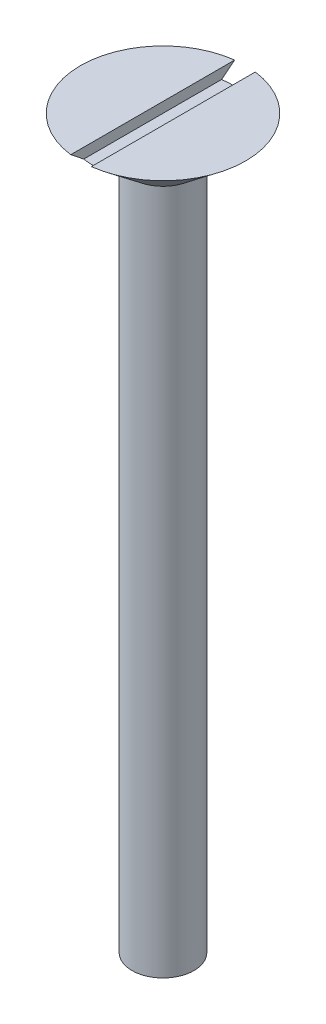
ISO-10303-21;
HEADER;
FILE_DESCRIPTION(('STEP AP214'),'2;1');
FILE_NAME('part.step','',(''),(''),'','','');
FILE_SCHEMA(('AUTOMOTIVE_DESIGN { 1 0 10303 214 1 1 1 1 }'));
ENDSEC;
DATA;
#1=APPLICATION_CONTEXT('core data for automotive mechanical design processes');
#2=APPLICATION_PROTOCOL_DEFINITION('international standard','automotive_design',2000,#1);
#3=PRODUCT_CONTEXT('',#1,'mechanical');
#4=PRODUCT('Part','Part','',(#3));
#5=PRODUCT_RELATED_PRODUCT_CATEGORY('part','',(#4));
#6=PRODUCT_DEFINITION_FORMATION('','',#4);
#7=PRODUCT_DEFINITION_CONTEXT('part definition',#1,'design');
#8=PRODUCT_DEFINITION('design','',#6,#7);
#9=PRODUCT_DEFINITION_SHAPE('','',#8);
#10=(LENGTH_UNIT() NAMED_UNIT(*) SI_UNIT(.MILLI.,.METRE.));
#11=(NAMED_UNIT(*) PLANE_ANGLE_UNIT() SI_UNIT($,.RADIAN.));
#12=(NAMED_UNIT(*) SI_UNIT($,.STERADIAN.) SOLID_ANGLE_UNIT());
#13=UNCERTAINTY_MEASURE_WITH_UNIT(LENGTH_MEASURE(1.E-05),#10,'distance_accuracy_value','');
#14=(GEOMETRIC_REPRESENTATION_CONTEXT(3) GLOBAL_UNCERTAINTY_ASSIGNED_CONTEXT((#13)) GLOBAL_UNIT_ASSIGNED_CONTEXT((#10,
#11,#12)) REPRESENTATION_CONTEXT('',''));
#15=CARTESIAN_POINT('',(0.,0.,0.));
#16=DIRECTION('',(0.,0.,1.));
#17=DIRECTION('',(1.,0.,0.));
#18=AXIS2_PLACEMENT_3D('',#15,#16,#17);
#19=CARTESIAN_POINT('',(0.,0.,0.));
#20=DIRECTION('',(0.,1.,0.));
#21=DIRECTION('',(0.,0.,1.));
#22=AXIS2_PLACEMENT_3D('',#19,#20,#21);
#23=PLANE('',#22);
#24=DIRECTION('',(0.,0.,-1.));
#25=VECTOR('',#24,1.);
#26=CARTESIAN_POINT('',(0.5,0.,4.154122802003));
#27=LINE('',#26,#25);
#28=CARTESIAN_POINT('',(0.5,0.,3.96862696659689));
#29=VERTEX_POINT('',#28);
#30=CARTESIAN_POINT('',(0.5,0.,-3.96862696659689));
#31=VERTEX_POINT('',#30);
#32=EDGE_CURVE('E90',#29,#31,#27,.T.);
#33=ORIENTED_EDGE('',*,*,#32,.F.);
#34=CARTESIAN_POINT('',(0.,0.,0.));
#35=DIRECTION('',(0.,-1.,0.));
#36=DIRECTION('',(0.,0.,-1.));
#37=AXIS2_PLACEMENT_3D('',#34,#35,#36);
#38=CIRCLE('',#37,4.);
#39=EDGE_CURVE('E97',#31,#29,#38,.T.);
#40=ORIENTED_EDGE('',*,*,#39,.F.);
#41=EDGE_LOOP('',(#33,#40));
#42=FACE_BOUND('',#41,.T.);
#43=ADVANCED_FACE('F43',(#42),#23,.T.);
#44=DIRECTION('',(0.,0.,1.));
#45=VECTOR('',#44,1.);
#46=CARTESIAN_POINT('',(-0.5,0.,4.154122802003));
#47=LINE('',#46,#45);
#48=CARTESIAN_POINT('',(-0.5,0.,-3.96862696659689));
#49=VERTEX_POINT('',#48);
#50=CARTESIAN_POINT('',(-0.5,0.,3.96862696659689));
#51=VERTEX_POINT('',#50);
#52=EDGE_CURVE('E98',#49,#51,#47,.T.);
#53=ORIENTED_EDGE('',*,*,#52,.F.);
#54=EDGE_CURVE('E105',#51,#49,#38,.T.);
#55=ORIENTED_EDGE('',*,*,#54,.F.);
#56=EDGE_LOOP('',(#53,#55));
#57=FACE_BOUND('',#56,.T.);
#58=ADVANCED_FACE('F45',(#57),#23,.T.);
#59=CARTESIAN_POINT('',(0.,-2.,0.));
#60=DIRECTION('',(0.,1.,0.));
#61=DIRECTION('',(0.,0.,1.));
#62=AXIS2_PLACEMENT_3D('',#59,#60,#61);
#63=CONICAL_SURFACE('',#62,1.5,0.896055384571344);
#64=CARTESIAN_POINT('',(0.5,0.0007,-3.96950888216981));
#65=CARTESIAN_POINT('',(0.5,-0.0849165023699563,-3.86163967543168));
#66=CARTESIAN_POINT('',(0.5,-0.170502285170619,-3.75374605179473));
#67=CARTESIAN_POINT('',(0.5,-0.341656342764282,-3.53780257000272));
#68=CARTESIAN_POINT('',(0.5,-0.427224547201753,-3.42975265608924));
#69=CARTESIAN_POINT('',(0.5,-0.599310209490072,-3.21222191026573));
#70=CARTESIAN_POINT('',(0.5,-0.685826263463784,-3.10273996752559));
#71=CARTESIAN_POINT('',(0.5,-0.858631507298039,-2.88374094085675));
#72=CARTESIAN_POINT('',(0.5,-0.944920824127245,-2.77422395715472));
#73=CARTESIAN_POINT('',(0.5,-1.10449390377997,-2.57127620190392));
#74=CARTESIAN_POINT('',(0.5,-1.17780799299997,-2.47786928127077));
#75=CARTESIAN_POINT('',(0.5,-1.32422251325456,-2.290871081503));
#76=CARTESIAN_POINT('',(0.5,-1.39732291936885,-2.19727978284154));
#77=CARTESIAN_POINT('',(0.5,-1.54343242848754,-2.00955497780229));
#78=CARTESIAN_POINT('',(0.5,-1.61644052942068,-1.9154206912297));
#79=CARTESIAN_POINT('',(0.5,-1.76194048771337,-1.7268187631654));
#80=CARTESIAN_POINT('',(0.5,-1.83443255740708,-1.63235128594972));
#81=CARTESIAN_POINT('',(0.5,-1.97776998979503,-1.44394309616818));
#82=CARTESIAN_POINT('',(0.5,-2.0486246832269,-1.35000948104741));
#83=CARTESIAN_POINT('',(0.5,-2.18913129599316,-1.16099731994404));
#84=CARTESIAN_POINT('',(0.5,-2.25878106402711,-1.06591715581982));
#85=CARTESIAN_POINT('',(0.5,-2.36099982523872,-0.922138886261497));
#86=CARTESIAN_POINT('',(0.5,-2.39459472985591,-0.874172268915431));
#87=CARTESIAN_POINT('',(0.5,-2.46074016373396,-0.777526804450004));
#88=CARTESIAN_POINT('',(0.5,-2.49329083769703,-0.728848057385722));
#89=CARTESIAN_POINT('',(0.5,-2.55664185197658,-0.630541590346451));
#90=CARTESIAN_POINT('',(0.5,-2.58744653072054,-0.580916672551348));
#91=CARTESIAN_POINT('',(0.5,-2.64620420928734,-0.480016414066409));
#92=CARTESIAN_POINT('',(0.5,-2.67416068922349,-0.428743190707143));
#93=CARTESIAN_POINT('',(0.5,-2.70449858296453,-0.365644309264434));
#94=CARTESIAN_POINT('',(0.5,-2.70945461893437,-0.355060527391768));
#95=CARTESIAN_POINT('',(0.5,-2.7191145434353,-0.333776664640728));
#96=CARTESIAN_POINT('',(0.5,-2.72381839025734,-0.323076564874589));
#97=CARTESIAN_POINT('',(0.5,-2.73749944880417,-0.290796283206236));
#98=CARTESIAN_POINT('',(0.5,-2.7460487095841,-0.26903093328599));
#99=CARTESIAN_POINT('',(0.5,-2.76155676868638,-0.22526154121403));
#100=CARTESIAN_POINT('',(0.5,-2.76853530900078,-0.203264584548543));
#101=CARTESIAN_POINT('',(0.5,-2.78065410784344,-0.158758052606351));
#102=CARTESIAN_POINT('',(0.5,-2.78579443356758,-0.13624849609972));
#103=CARTESIAN_POINT('',(0.5,-2.79309908524597,-0.0950072414424992));
#104=CARTESIAN_POINT('',(0.5,-2.79563695186348,-0.0763424492707343));
#105=CARTESIAN_POINT('',(0.5,-2.79907103222669,-0.0388695155849392));
#106=CARTESIAN_POINT('',(0.5,-2.79996787253948,-0.0200614315372762));
#107=CARTESIAN_POINT('',(0.5,-2.80006039024912,0.0362991883155137));
#108=CARTESIAN_POINT('',(0.5,-2.79667500883115,0.0738792604370195));
#109=CARTESIAN_POINT('',(0.5,-2.78137004038277,0.162466941108722));
#110=CARTESIAN_POINT('',(0.5,-2.76662066728367,0.212950897532982));
#111=CARTESIAN_POINT('',(0.5,-2.73921524830917,0.286771538817558));
#112=CARTESIAN_POINT('',(0.5,-2.72913282569691,0.311183854779621));
#113=CARTESIAN_POINT('',(0.5,-2.70763740364262,0.35941708149117));
#114=CARTESIAN_POINT('',(0.5,-2.69622480381569,0.3832381672643));
#115=CARTESIAN_POINT('',(0.5,-2.65774182427754,0.459494267363883));
#116=CARTESIAN_POINT('',(0.5,-2.62873915199804,0.510939109138477));
#117=CARTESIAN_POINT('',(0.5,-2.56815383743606,0.612300106377371));
#118=CARTESIAN_POINT('',(0.5,-2.53656877244107,0.662214764503145));
#119=CARTESIAN_POINT('',(0.5,-2.47180178509868,0.761157389350541));
#120=CARTESIAN_POINT('',(0.5,-2.43861634586317,0.810183044014906));
#121=CARTESIAN_POINT('',(0.5,-2.37127990274308,0.907568911622613));
#122=CARTESIAN_POINT('',(0.5,-2.33712879565317,0.955929052612087));
#123=CARTESIAN_POINT('',(0.5,-2.23364926190614,1.10045142784891));
#124=CARTESIAN_POINT('',(0.5,-2.1633761057542,1.19593529439254));
#125=CARTESIAN_POINT('',(0.5,-2.02169747569066,1.38582135122896));
#126=CARTESIAN_POINT('',(0.5,-1.95029390545647,1.48022497690765));
#127=CARTESIAN_POINT('',(0.5,-1.80109959502258,1.67590003480187));
#128=CARTESIAN_POINT('',(0.5,-1.72324920791508,1.77712598596886));
#129=CARTESIAN_POINT('',(0.5,-1.56703755198854,1.9791846282383));
#130=CARTESIAN_POINT('',(0.5,-1.48867627425172,2.08001731242677));
#131=CARTESIAN_POINT('',(0.5,-1.25300183322107,2.38226692347977));
#132=CARTESIAN_POINT('',(0.5,-1.0952001533504,2.58330271919452));
#133=CARTESIAN_POINT('',(0.5,-0.781185129206328,2.98208851051039));
#134=CARTESIAN_POINT('',(0.5,-0.624980312880044,3.17984524024286));
#135=CARTESIAN_POINT('',(0.5,-0.312308061533087,3.5749237197886));
#136=CARTESIAN_POINT('',(0.5,-0.155840890320149,3.77224567830265));
#137=CARTESIAN_POINT('',(0.5,0.000699999999999761,3.96950888216981));
#138=B_SPLINE_CURVE_WITH_KNOTS('',3,(#64,#65,#66,#67,#68,#69,#70,#71,#72,#73,#74,#75,#76,#77,
#78,#79,#80,#81,#82,#83,#84,#85,#86,#87,#88,#89,#90,#91,#92,#93,#94,#95,#96,#97,#98,#99,#100,
#101,#102,#103,#104,#105,#106,#107,#108,#109,#110,#111,#112,#113,#114,#115,#116,#117,#118,#119,
#120,#121,#122,#123,#124,#125,#126,#127,#128,#129,#130,#131,#132,#133,#134,#135,#136,#137),
.UNSPECIFIED.,.F.,.F.,(4,2,2,2,2,2,2,2,2,2,2,2,2,2,2,2,2,2,2,2,2,2,2,2,2,2,2,2,2,2,2,2,2,2,2,2,
4),(0.,0.413150808554029,0.82663632537773,1.24525527914814,1.66353528711512,2.01976291794065,
2.37603055608401,2.73341339965948,3.09063953124349,3.44361707873357,3.79717060116175,
3.97284705295861,4.14849905464527,4.32369351642409,4.49867128014781,4.53372821673397,
4.56879093354214,4.63889907513082,4.70806957493471,4.77723754595436,4.83367940292317,
4.89009970509133,5.00266641980551,5.15944717162594,5.23867342336855,5.31787593481953,
5.49488269462284,5.67205746474493,5.84964110426015,6.02724379522197,6.38288495455736,
6.73798020727408,7.12107781132008,7.50418212047784,8.27089298468056,9.02691460274215,
9.78240162361555),.UNSPECIFIED.);
#139=CARTESIAN_POINT('',(0.5,-0.5,3.33775748070467));
#140=VERTEX_POINT('',#139);
#141=EDGE_CURVE('E11',#140,#29,#138,.T.);
#142=ORIENTED_EDGE('',*,*,#141,.F.);
#143=CARTESIAN_POINT('',(0.,-0.5,0.));
#144=DIRECTION('',(0.,-1.,0.));
#145=DIRECTION('',(0.,0.,-1.));
#146=AXIS2_PLACEMENT_3D('',#143,#144,#145);
#147=CIRCLE('',#146,3.375);
#148=CARTESIAN_POINT('',(-0.5,-0.5,3.33775748070467));
#149=VERTEX_POINT('',#148);
#150=EDGE_CURVE('E109',#149,#140,#147,.F.);
#151=ORIENTED_EDGE('',*,*,#150,.F.);
#152=CARTESIAN_POINT('',(-0.5,0.0007,3.96950888216981));
#153=CARTESIAN_POINT('',(-0.5,-0.0849165023699563,3.86163967543168));
#154=CARTESIAN_POINT('',(-0.5,-0.170502285170619,3.75374605179473));
#155=CARTESIAN_POINT('',(-0.5,-0.341656342764282,3.53780257000272));
#156=CARTESIAN_POINT('',(-0.5,-0.427224547201753,3.42975265608924));
#157=CARTESIAN_POINT('',(-0.5,-0.599310209490072,3.21222191026573));
#158=CARTESIAN_POINT('',(-0.5,-0.685826263463784,3.10273996752559));
#159=CARTESIAN_POINT('',(-0.5,-0.858631507298039,2.88374094085675));
#160=CARTESIAN_POINT('',(-0.5,-0.944920824127245,2.77422395715472));
#161=CARTESIAN_POINT('',(-0.5,-1.10449390377997,2.57127620190392));
#162=CARTESIAN_POINT('',(-0.5,-1.17780799299997,2.47786928127077));
#163=CARTESIAN_POINT('',(-0.5,-1.32422251325456,2.290871081503));
#164=CARTESIAN_POINT('',(-0.5,-1.39732291936885,2.19727978284154));
#165=CARTESIAN_POINT('',(-0.5,-1.54343242848754,2.00955497780229));
#166=CARTESIAN_POINT('',(-0.5,-1.61644052942068,1.9154206912297));
#167=CARTESIAN_POINT('',(-0.5,-1.76194048771337,1.7268187631654));
#168=CARTESIAN_POINT('',(-0.5,-1.83443255740708,1.63235128594972));
#169=CARTESIAN_POINT('',(-0.5,-1.97776998979503,1.44394309616818));
#170=CARTESIAN_POINT('',(-0.5,-2.0486246832269,1.35000948104741));
#171=CARTESIAN_POINT('',(-0.5,-2.18913129599316,1.16099731994404));
#172=CARTESIAN_POINT('',(-0.5,-2.25878106402711,1.06591715581982));
#173=CARTESIAN_POINT('',(-0.5,-2.36099982523872,0.922138886261497));
#174=CARTESIAN_POINT('',(-0.5,-2.39459472985591,0.874172268915431));
#175=CARTESIAN_POINT('',(-0.5,-2.46074016373396,0.777526804450004));
#176=CARTESIAN_POINT('',(-0.5,-2.49329083769703,0.728848057385722));
#177=CARTESIAN_POINT('',(-0.5,-2.55664185197658,0.630541590346451));
#178=CARTESIAN_POINT('',(-0.5,-2.58744653072054,0.580916672551348));
#179=CARTESIAN_POINT('',(-0.5,-2.64620420928734,0.480016414066409));
#180=CARTESIAN_POINT('',(-0.5,-2.67416068922349,0.428743190707143));
#181=CARTESIAN_POINT('',(-0.5,-2.70449858296453,0.365644309264434));
#182=CARTESIAN_POINT('',(-0.5,-2.70945461893437,0.355060527391768));
#183=CARTESIAN_POINT('',(-0.5,-2.7191145434353,0.333776664640728));
#184=CARTESIAN_POINT('',(-0.5,-2.72381839025734,0.323076564874589));
#185=CARTESIAN_POINT('',(-0.5,-2.73749944880417,0.290796283206236));
#186=CARTESIAN_POINT('',(-0.5,-2.7460487095841,0.26903093328599));
#187=CARTESIAN_POINT('',(-0.5,-2.76155676868638,0.22526154121403));
#188=CARTESIAN_POINT('',(-0.5,-2.76853530900078,0.203264584548543));
#189=CARTESIAN_POINT('',(-0.5,-2.78065410784344,0.158758052606351));
#190=CARTESIAN_POINT('',(-0.5,-2.78579443356758,0.13624849609972));
#191=CARTESIAN_POINT('',(-0.5,-2.79309908524597,0.0950072414424992));
#192=CARTESIAN_POINT('',(-0.5,-2.79563695186348,0.0763424492707343));
#193=CARTESIAN_POINT('',(-0.5,-2.79907103222669,0.0388695155849392));
#194=CARTESIAN_POINT('',(-0.5,-2.79996787253948,0.0200614315372762));
#195=CARTESIAN_POINT('',(-0.5,-2.80006039024912,-0.0362991883155137));
#196=CARTESIAN_POINT('',(-0.5,-2.79667500883115,-0.0738792604370195));
#197=CARTESIAN_POINT('',(-0.5,-2.78137004038277,-0.162466941108722));
#198=CARTESIAN_POINT('',(-0.5,-2.76662066728367,-0.212950897532982));
#199=CARTESIAN_POINT('',(-0.5,-2.73921524830917,-0.286771538817558));
#200=CARTESIAN_POINT('',(-0.5,-2.72913282569691,-0.311183854779621));
#201=CARTESIAN_POINT('',(-0.5,-2.70763740364262,-0.35941708149117));
#202=CARTESIAN_POINT('',(-0.5,-2.69622480381569,-0.3832381672643));
#203=CARTESIAN_POINT('',(-0.5,-2.65774182427754,-0.459494267363883));
#204=CARTESIAN_POINT('',(-0.5,-2.62873915199804,-0.510939109138477));
#205=CARTESIAN_POINT('',(-0.5,-2.56815383743606,-0.612300106377371));
#206=CARTESIAN_POINT('',(-0.5,-2.53656877244107,-0.662214764503145));
#207=CARTESIAN_POINT('',(-0.5,-2.47180178509868,-0.761157389350541));
#208=CARTESIAN_POINT('',(-0.5,-2.43861634586317,-0.810183044014906));
#209=CARTESIAN_POINT('',(-0.5,-2.37127990274308,-0.907568911622613));
#210=CARTESIAN_POINT('',(-0.5,-2.33712879565317,-0.955929052612087));
#211=CARTESIAN_POINT('',(-0.5,-2.23364926190614,-1.10045142784891));
#212=CARTESIAN_POINT('',(-0.5,-2.1633761057542,-1.19593529439254));
#213=CARTESIAN_POINT('',(-0.5,-2.02169747569066,-1.38582135122896));
#214=CARTESIAN_POINT('',(-0.5,-1.95029390545647,-1.48022497690765));
#215=CARTESIAN_POINT('',(-0.5,-1.80109959502258,-1.67590003480187));
#216=CARTESIAN_POINT('',(-0.5,-1.72324920791508,-1.77712598596886));
#217=CARTESIAN_POINT('',(-0.5,-1.56703755198854,-1.9791846282383));
#218=CARTESIAN_POINT('',(-0.5,-1.48867627425172,-2.08001731242677));
#219=CARTESIAN_POINT('',(-0.5,-1.25300183322107,-2.38226692347977));
#220=CARTESIAN_POINT('',(-0.5,-1.0952001533504,-2.58330271919452));
#221=CARTESIAN_POINT('',(-0.5,-0.781185129206328,-2.98208851051039));
#222=CARTESIAN_POINT('',(-0.5,-0.624980312880044,-3.17984524024286));
#223=CARTESIAN_POINT('',(-0.5,-0.312308061533087,-3.5749237197886));
#224=CARTESIAN_POINT('',(-0.5,-0.155840890320149,-3.77224567830265));
#225=CARTESIAN_POINT('',(-0.5,0.000699999999999761,-3.96950888216981));
#226=B_SPLINE_CURVE_WITH_KNOTS('',3,(#152,#153,#154,#155,#156,#157,#158,#159,#160,#161,#162,
#163,#164,#165,#166,#167,#168,#169,#170,#171,#172,#173,#174,#175,#176,#177,#178,#179,#180,#181,
#182,#183,#184,#185,#186,#187,#188,#189,#190,#191,#192,#193,#194,#195,#196,#197,#198,#199,#200,
#201,#202,#203,#204,#205,#206,#207,#208,#209,#210,#211,#212,#213,#214,#215,#216,#217,#218,#219,
#220,#221,#222,#223,#224,#225),.UNSPECIFIED.,.F.,.F.,(4,2,2,2,2,2,2,2,2,2,2,2,2,2,2,2,2,2,2,2,2,
2,2,2,2,2,2,2,2,2,2,2,2,2,2,2,4),(0.,0.413150808554029,0.82663632537773,1.24525527914814,
1.66353528711512,2.01976291794065,2.37603055608401,2.73341339965948,3.09063953124349,
3.44361707873357,3.79717060116175,3.97284705295861,4.14849905464527,4.32369351642409,
4.49867128014781,4.53372821673397,4.56879093354214,4.63889907513082,4.70806957493471,
4.77723754595436,4.83367940292317,4.89009970509133,5.00266641980551,5.15944717162594,
5.23867342336855,5.31787593481953,5.49488269462284,5.67205746474493,5.84964110426015,
6.02724379522197,6.38288495455736,6.73798020727408,7.12107781132008,7.50418212047784,
8.27089298468056,9.02691460274215,9.78240162361555),.UNSPECIFIED.);
#227=EDGE_CURVE('E57',#51,#149,#226,.T.);
#228=ORIENTED_EDGE('',*,*,#227,.F.);
#229=ORIENTED_EDGE('',*,*,#54,.T.);
#230=CARTESIAN_POINT('',(-0.5,-0.5,-3.33775748070467));
#231=VERTEX_POINT('',#230);
#232=EDGE_CURVE('E107',#231,#49,#226,.T.);
#233=ORIENTED_EDGE('',*,*,#232,.F.);
#234=CARTESIAN_POINT('',(0.5,-0.5,-3.33775748070467));
#235=VERTEX_POINT('',#234);
#236=EDGE_CURVE('E104',#235,#231,#147,.F.);
#237=ORIENTED_EDGE('',*,*,#236,.F.);
#238=EDGE_CURVE('E47',#31,#235,#138,.T.);
#239=ORIENTED_EDGE('',*,*,#238,.F.);
#240=ORIENTED_EDGE('',*,*,#39,.T.);
#241=EDGE_LOOP('',(#142,#151,#228,#229,#233,#237,#239,#240));
#242=FACE_BOUND('',#241,.T.);
#243=CARTESIAN_POINT('',(0.,-2.,0.));
#244=DIRECTION('',(0.,-1.,0.));
#245=DIRECTION('',(0.,0.,-1.));
#246=AXIS2_PLACEMENT_3D('',#243,#244,#245);
#247=CIRCLE('',#246,1.5);
#248=CARTESIAN_POINT('',(0.,-2.,1.5));
#249=VERTEX_POINT('',#248);
#250=EDGE_CURVE('E111',#249,#249,#247,.T.);
#251=ORIENTED_EDGE('',*,*,#250,.F.);
#252=EDGE_LOOP('',(#251));
#253=FACE_BOUND('',#252,.T.);
#254=ADVANCED_FACE('F101',(#242,#253),#63,.T.);
#255=CARTESIAN_POINT('',(0.5,-0.5,4.154122802003));
#256=DIRECTION('',(1.,0.,0.));
#257=DIRECTION('',(0.,0.,-1.));
#258=AXIS2_PLACEMENT_3D('',#255,#256,#257);
#259=PLANE('',#258);
#260=ORIENTED_EDGE('',*,*,#238,.T.);
#261=DIRECTION('',(0.,0.,-1.));
#262=VECTOR('',#261,1.);
#263=CARTESIAN_POINT('',(0.5,-0.5,4.154122802003));
#264=LINE('',#263,#262);
#265=EDGE_CURVE('E64',#140,#235,#264,.T.);
#266=ORIENTED_EDGE('',*,*,#265,.F.);
#267=ORIENTED_EDGE('',*,*,#141,.T.);
#268=ORIENTED_EDGE('',*,*,#32,.T.);
#269=EDGE_LOOP('',(#260,#266,#267,#268));
#270=FACE_BOUND('',#269,.T.);
#271=ADVANCED_FACE('F89',(#270),#259,.F.);
#272=CARTESIAN_POINT('',(-0.5,-0.5,4.154122802003));
#273=DIRECTION('',(-1.,0.,0.));
#274=DIRECTION('',(0.,0.,1.));
#275=AXIS2_PLACEMENT_3D('',#272,#273,#274);
#276=PLANE('',#275);
#277=ORIENTED_EDGE('',*,*,#227,.T.);
#278=DIRECTION('',(0.,0.,1.));
#279=VECTOR('',#278,1.);
#280=CARTESIAN_POINT('',(-0.5,-0.5,4.154122802003));
#281=LINE('',#280,#279);
#282=EDGE_CURVE('E141',#231,#149,#281,.T.);
#283=ORIENTED_EDGE('',*,*,#282,.F.);
#284=ORIENTED_EDGE('',*,*,#232,.T.);
#285=ORIENTED_EDGE('',*,*,#52,.T.);
#286=EDGE_LOOP('',(#277,#283,#284,#285));
#287=FACE_BOUND('',#286,.T.);
#288=ADVANCED_FACE('F120',(#287),#276,.F.);
#289=CARTESIAN_POINT('',(0.,-0.5,0.));
#290=DIRECTION('',(0.,-1.,0.));
#291=DIRECTION('',(0.,0.,-1.));
#292=AXIS2_PLACEMENT_3D('',#289,#290,#291);
#293=PLANE('',#292);
#294=ORIENTED_EDGE('',*,*,#150,.T.);
#295=ORIENTED_EDGE('',*,*,#265,.T.);
#296=ORIENTED_EDGE('',*,*,#236,.T.);
#297=ORIENTED_EDGE('',*,*,#282,.T.);
#298=EDGE_LOOP('',(#294,#295,#296,#297));
#299=FACE_BOUND('',#298,.T.);
#300=ADVANCED_FACE('F124',(#299),#293,.F.);
#301=CARTESIAN_POINT('',(0.,-35.2,0.));
#302=DIRECTION('',(0.,1.,0.));
#303=DIRECTION('',(0.,0.,1.));
#304=AXIS2_PLACEMENT_3D('',#301,#302,#303);
#305=CYLINDRICAL_SURFACE('',#304,1.5);
#306=CARTESIAN_POINT('',(0.,-35.2,0.));
#307=DIRECTION('',(0.,-1.,0.));
#308=DIRECTION('',(0.,0.,-1.));
#309=AXIS2_PLACEMENT_3D('',#306,#307,#308);
#310=CIRCLE('',#309,1.5);
#311=CARTESIAN_POINT('',(0.,-35.2,1.5));
#312=VERTEX_POINT('',#311);
#313=EDGE_CURVE('E99',#312,#312,#310,.T.);
#314=CARTESIAN_POINT('',(0.,-35.2,1.5));
#315=CARTESIAN_POINT('',(0.,-34.8541666666667,1.5));
#316=CARTESIAN_POINT('',(0.,-34.5083333333333,1.5));
#317=CARTESIAN_POINT('',(0.,-33.8166666666667,1.5));
#318=CARTESIAN_POINT('',(0.,-33.4708333333333,1.5));
#319=CARTESIAN_POINT('',(0.,-32.7791666666667,1.5));
#320=CARTESIAN_POINT('',(0.,-32.4333333333333,1.5));
#321=CARTESIAN_POINT('',(0.,-31.7416666666667,1.5));
#322=CARTESIAN_POINT('',(0.,-31.3958333333333,1.5));
#323=CARTESIAN_POINT('',(0.,-30.7041666666667,1.5));
#324=CARTESIAN_POINT('',(0.,-30.3583333333333,1.5));
#325=CARTESIAN_POINT('',(0.,-29.6666666666667,1.5));
#326=CARTESIAN_POINT('',(0.,-29.3208333333333,1.5));
#327=CARTESIAN_POINT('',(0.,-28.6291666666667,1.5));
#328=CARTESIAN_POINT('',(0.,-28.2833333333333,1.5));
#329=CARTESIAN_POINT('',(0.,-27.5916666666667,1.5));
#330=CARTESIAN_POINT('',(0.,-27.2458333333333,1.5));
#331=CARTESIAN_POINT('',(0.,-26.5541666666667,1.5));
#332=CARTESIAN_POINT('',(0.,-26.2083333333333,1.5));
#333=CARTESIAN_POINT('',(0.,-25.5166666666667,1.5));
#334=CARTESIAN_POINT('',(0.,-25.1708333333333,1.5));
#335=CARTESIAN_POINT('',(0.,-24.4791666666667,1.5));
#336=CARTESIAN_POINT('',(0.,-24.1333333333333,1.5));
#337=CARTESIAN_POINT('',(0.,-23.4416666666667,1.5));
#338=CARTESIAN_POINT('',(0.,-23.0958333333333,1.5));
#339=CARTESIAN_POINT('',(0.,-22.4041666666667,1.5));
#340=CARTESIAN_POINT('',(0.,-22.0583333333333,1.5));
#341=CARTESIAN_POINT('',(0.,-21.3666666666667,1.5));
#342=CARTESIAN_POINT('',(0.,-21.0208333333333,1.5));
#343=CARTESIAN_POINT('',(0.,-20.3291666666667,1.5));
#344=CARTESIAN_POINT('',(0.,-19.9833333333333,1.5));
#345=CARTESIAN_POINT('',(0.,-19.2916666666667,1.5));
#346=CARTESIAN_POINT('',(0.,-18.9458333333333,1.5));
#347=CARTESIAN_POINT('',(0.,-18.2541666666667,1.5));
#348=CARTESIAN_POINT('',(0.,-17.9083333333333,1.5));
#349=CARTESIAN_POINT('',(0.,-17.2166666666667,1.5));
#350=CARTESIAN_POINT('',(0.,-16.8708333333333,1.5));
#351=CARTESIAN_POINT('',(0.,-16.1791666666667,1.5));
#352=CARTESIAN_POINT('',(0.,-15.8333333333333,1.5));
#353=CARTESIAN_POINT('',(0.,-15.1416666666667,1.5));
#354=CARTESIAN_POINT('',(0.,-14.7958333333333,1.5));
#355=CARTESIAN_POINT('',(0.,-14.1041666666667,1.5));
#356=CARTESIAN_POINT('',(0.,-13.7583333333333,1.5));
#357=CARTESIAN_POINT('',(0.,-13.0666666666667,1.5));
#358=CARTESIAN_POINT('',(0.,-12.7208333333333,1.5));
#359=CARTESIAN_POINT('',(0.,-12.0291666666667,1.5));
#360=CARTESIAN_POINT('',(0.,-11.6833333333333,1.5));
#361=CARTESIAN_POINT('',(0.,-10.9916666666667,1.5));
#362=CARTESIAN_POINT('',(0.,-10.6458333333333,1.5));
#363=CARTESIAN_POINT('',(0.,-9.95416666666667,1.5));
#364=CARTESIAN_POINT('',(0.,-9.60833333333334,1.5));
#365=CARTESIAN_POINT('',(0.,-8.91666666666667,1.5));
#366=CARTESIAN_POINT('',(0.,-8.57083333333334,1.5));
#367=CARTESIAN_POINT('',(0.,-7.87916666666667,1.5));
#368=CARTESIAN_POINT('',(0.,-7.53333333333334,1.5));
#369=CARTESIAN_POINT('',(0.,-6.84166666666667,1.5));
#370=CARTESIAN_POINT('',(0.,-6.49583333333334,1.5));
#371=CARTESIAN_POINT('',(0.,-5.80416666666667,1.5));
#372=CARTESIAN_POINT('',(0.,-5.45833333333334,1.5));
#373=CARTESIAN_POINT('',(0.,-4.76666666666667,1.5));
#374=CARTESIAN_POINT('',(0.,-4.42083333333334,1.5));
#375=CARTESIAN_POINT('',(0.,-3.72916666666667,1.5));
#376=CARTESIAN_POINT('',(0.,-3.38333333333333,1.5));
#377=CARTESIAN_POINT('',(0.,-2.69166666666667,1.5));
#378=CARTESIAN_POINT('',(0.,-2.34583333333333,1.5));
#379=CARTESIAN_POINT('',(0.,-2.,1.5));
#380=B_SPLINE_CURVE_WITH_KNOTS('',3,(#314,#315,#316,#317,#318,#319,#320,#321,#322,#323,#324,
#325,#326,#327,#328,#329,#330,#331,#332,#333,#334,#335,#336,#337,#338,#339,#340,#341,#342,#343,
#344,#345,#346,#347,#348,#349,#350,#351,#352,#353,#354,#355,#356,#357,#358,#359,#360,#361,#362,
#363,#364,#365,#366,#367,#368,#369,#370,#371,#372,#373,#374,#375,#376,#377,#378,#379),
.UNSPECIFIED.,.F.,.F.,(4,2,2,2,2,2,2,2,2,2,2,2,2,2,2,2,2,2,2,2,2,2,2,2,2,2,2,2,2,2,2,2,4),(0.,
1.0375,2.07499999999999,3.1125,4.14999999999999,5.1875,6.22499999999999,7.26249999999999,8.3,
9.3375,10.375,11.4125,12.45,13.4875,14.525,15.5625,16.6,17.6375,18.675,19.7125,20.75,21.7875,
22.825,23.8625,24.9,25.9375,26.975,28.0125,29.05,30.0875,31.125,32.1625,33.2),.UNSPECIFIED.);
#381=EDGE_CURVE('BSEAM151',#312,#249,#380,.T.);
#382=ORIENTED_EDGE('',*,*,#313,.F.);
#383=ORIENTED_EDGE('',*,*,#250,.T.);
#384=ORIENTED_EDGE('',*,*,#381,.T.);
#385=ORIENTED_EDGE('',*,*,#381,.F.);
#386=EDGE_LOOP('',(#382,#384,#383,#385));
#387=FACE_BOUND('',#386,.T.);
#388=ADVANCED_FACE('F151',(#387),#305,.T.);
#389=CARTESIAN_POINT('',(0.,-35.2,0.));
#390=DIRECTION('',(0.,-1.,0.));
#391=DIRECTION('',(0.,0.,-1.));
#392=AXIS2_PLACEMENT_3D('',#389,#390,#391);
#393=PLANE('',#392);
#394=ORIENTED_EDGE('',*,*,#313,.T.);
#395=EDGE_LOOP('',(#394));
#396=FACE_BOUND('',#395,.T.);
#397=ADVANCED_FACE('F149',(#396),#393,.T.);
#398=CLOSED_SHELL('',(#43,#58,#254,#271,#288,#300,#388,#397));
#399=MANIFOLD_SOLID_BREP('B2',#398);
#400=ADVANCED_BREP_SHAPE_REPRESENTATION('',(#18,#399),#14);
#401=SHAPE_DEFINITION_REPRESENTATION(#9,#400);
ENDSEC;
END-ISO-10303-21;
